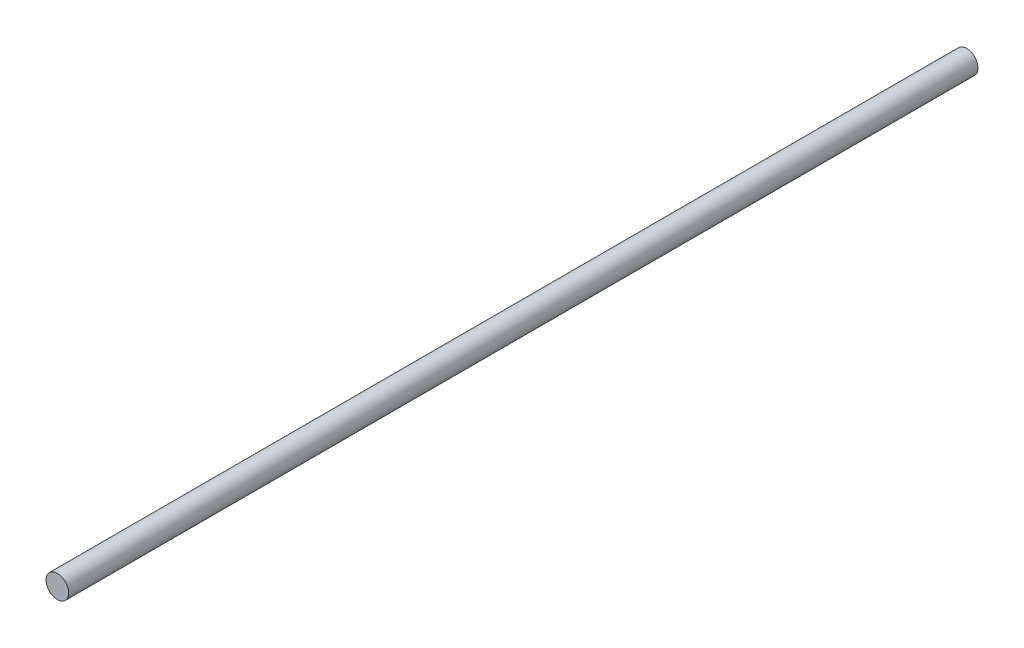
ISO-10303-21;
HEADER;
FILE_DESCRIPTION(('STEP AP214'),'2;1');
FILE_NAME('part.step','',(''),(''),'','','');
FILE_SCHEMA(('AUTOMOTIVE_DESIGN { 1 0 10303 214 1 1 1 1 }'));
ENDSEC;
DATA;
#1=APPLICATION_CONTEXT('core data for automotive mechanical design processes');
#2=APPLICATION_PROTOCOL_DEFINITION('international standard','automotive_design',2000,#1);
#3=PRODUCT_CONTEXT('',#1,'mechanical');
#4=PRODUCT('Part','Part','',(#3));
#5=PRODUCT_RELATED_PRODUCT_CATEGORY('part','',(#4));
#6=PRODUCT_DEFINITION_FORMATION('','',#4);
#7=PRODUCT_DEFINITION_CONTEXT('part definition',#1,'design');
#8=PRODUCT_DEFINITION('design','',#6,#7);
#9=PRODUCT_DEFINITION_SHAPE('','',#8);
#10=(LENGTH_UNIT() NAMED_UNIT(*) SI_UNIT(.MILLI.,.METRE.));
#11=(NAMED_UNIT(*) PLANE_ANGLE_UNIT() SI_UNIT($,.RADIAN.));
#12=(NAMED_UNIT(*) SI_UNIT($,.STERADIAN.) SOLID_ANGLE_UNIT());
#13=UNCERTAINTY_MEASURE_WITH_UNIT(LENGTH_MEASURE(1.E-05),#10,'distance_accuracy_value','');
#14=(GEOMETRIC_REPRESENTATION_CONTEXT(3) GLOBAL_UNCERTAINTY_ASSIGNED_CONTEXT((#13)) GLOBAL_UNIT_ASSIGNED_CONTEXT((#10,
#11,#12)) REPRESENTATION_CONTEXT('',''));
#15=CARTESIAN_POINT('',(0.,0.,0.));
#16=DIRECTION('',(0.,0.,1.));
#17=DIRECTION('',(1.,0.,0.));
#18=AXIS2_PLACEMENT_3D('',#15,#16,#17);
#19=CARTESIAN_POINT('',(0.,0.,160.));
#20=DIRECTION('',(0.,0.,-1.));
#21=DIRECTION('',(-1.,0.,0.));
#22=AXIS2_PLACEMENT_3D('',#19,#20,#21);
#23=CYLINDRICAL_SURFACE('',#22,2.);
#24=CARTESIAN_POINT('',(0.,0.,160.));
#25=DIRECTION('',(0.,0.,1.));
#26=DIRECTION('',(1.,0.,0.));
#27=AXIS2_PLACEMENT_3D('',#24,#25,#26);
#28=CIRCLE('',#27,2.);
#29=CARTESIAN_POINT('',(2.,0.,160.));
#30=VERTEX_POINT('',#29);
#31=EDGE_CURVE('E10',#30,#30,#28,.T.);
#32=ORIENTED_EDGE('',*,*,#31,.F.);
#33=EDGE_LOOP('',(#32));
#34=FACE_BOUND('',#33,.T.);
#35=CARTESIAN_POINT('',(0.,0.,0.));
#36=DIRECTION('',(0.,0.,1.));
#37=DIRECTION('',(1.,0.,0.));
#38=AXIS2_PLACEMENT_3D('',#35,#36,#37);
#39=CIRCLE('',#38,2.);
#40=CARTESIAN_POINT('',(2.,0.,0.));
#41=VERTEX_POINT('',#40);
#42=EDGE_CURVE('E33',#41,#41,#39,.T.);
#43=ORIENTED_EDGE('',*,*,#42,.T.);
#44=EDGE_LOOP('',(#43));
#45=FACE_BOUND('',#44,.T.);
#46=ADVANCED_FACE('F30',(#34,#45),#23,.T.);
#47=CARTESIAN_POINT('',(0.,0.,160.));
#48=DIRECTION('',(0.,0.,1.));
#49=DIRECTION('',(1.,0.,0.));
#50=AXIS2_PLACEMENT_3D('',#47,#48,#49);
#51=PLANE('',#50);
#52=ORIENTED_EDGE('',*,*,#31,.T.);
#53=EDGE_LOOP('',(#52));
#54=FACE_BOUND('',#53,.T.);
#55=ADVANCED_FACE('F45',(#54),#51,.T.);
#56=CARTESIAN_POINT('',(0.,0.,0.));
#57=DIRECTION('',(0.,0.,1.));
#58=DIRECTION('',(1.,0.,0.));
#59=AXIS2_PLACEMENT_3D('',#56,#57,#58);
#60=PLANE('',#59);
#61=ORIENTED_EDGE('',*,*,#42,.F.);
#62=EDGE_LOOP('',(#61));
#63=FACE_BOUND('',#62,.T.);
#64=ADVANCED_FACE('F43',(#63),#60,.F.);
#65=CLOSED_SHELL('',(#46,#55,#64));
#66=MANIFOLD_SOLID_BREP('B2',#65);
#67=ADVANCED_BREP_SHAPE_REPRESENTATION('',(#18,#66),#14);
#68=SHAPE_DEFINITION_REPRESENTATION(#9,#67);
ENDSEC;
END-ISO-10303-21;
